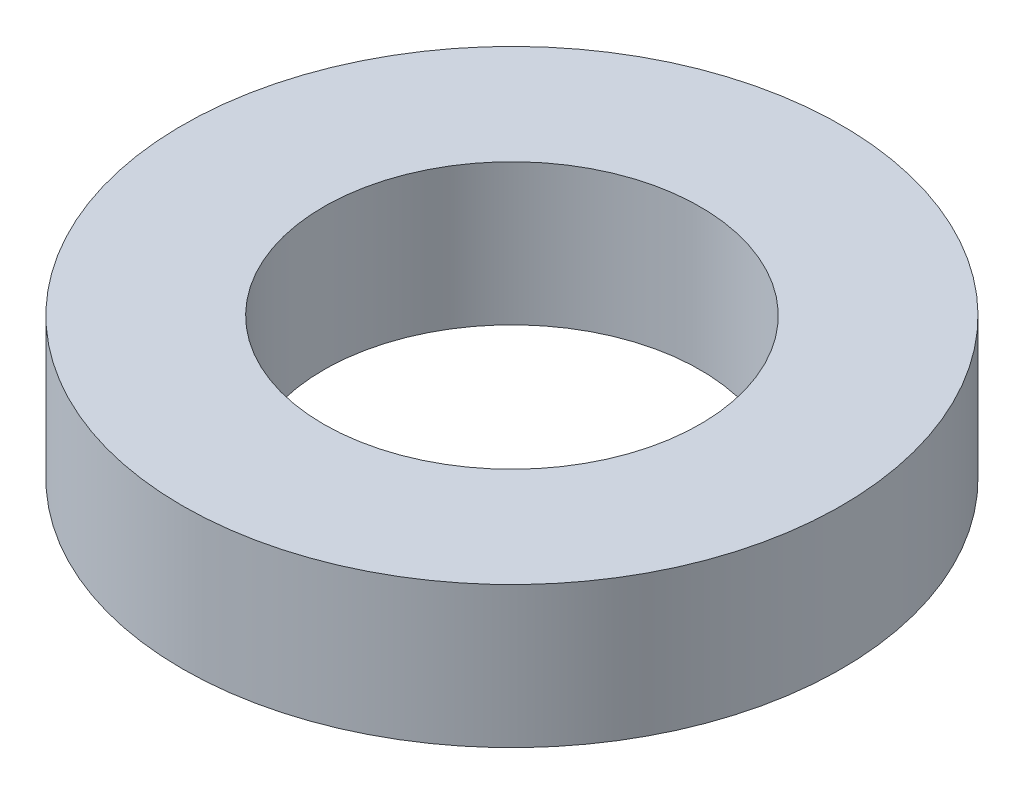
ISO-10303-21;
HEADER;
FILE_DESCRIPTION(('STEP AP214'),'2;1');
FILE_NAME('part.step','',(''),(''),'','','');
FILE_SCHEMA(('AUTOMOTIVE_DESIGN { 1 0 10303 214 1 1 1 1 }'));
ENDSEC;
DATA;
#1=APPLICATION_CONTEXT('core data for automotive mechanical design processes');
#2=APPLICATION_PROTOCOL_DEFINITION('international standard','automotive_design',2000,#1);
#3=PRODUCT_CONTEXT('',#1,'mechanical');
#4=PRODUCT('Part','Part','',(#3));
#5=PRODUCT_RELATED_PRODUCT_CATEGORY('part','',(#4));
#6=PRODUCT_DEFINITION_FORMATION('','',#4);
#7=PRODUCT_DEFINITION_CONTEXT('part definition',#1,'design');
#8=PRODUCT_DEFINITION('design','',#6,#7);
#9=PRODUCT_DEFINITION_SHAPE('','',#8);
#10=(LENGTH_UNIT() NAMED_UNIT(*) SI_UNIT(.MILLI.,.METRE.));
#11=(NAMED_UNIT(*) PLANE_ANGLE_UNIT() SI_UNIT($,.RADIAN.));
#12=(NAMED_UNIT(*) SI_UNIT($,.STERADIAN.) SOLID_ANGLE_UNIT());
#13=UNCERTAINTY_MEASURE_WITH_UNIT(LENGTH_MEASURE(1.E-05),#10,'distance_accuracy_value','');
#14=(GEOMETRIC_REPRESENTATION_CONTEXT(3) GLOBAL_UNCERTAINTY_ASSIGNED_CONTEXT((#13)) GLOBAL_UNIT_ASSIGNED_CONTEXT((#10,
#11,#12)) REPRESENTATION_CONTEXT('',''));
#15=CARTESIAN_POINT('',(0.,0.,0.));
#16=DIRECTION('',(0.,0.,1.));
#17=DIRECTION('',(1.,0.,0.));
#18=AXIS2_PLACEMENT_3D('',#15,#16,#17);
#19=CARTESIAN_POINT('',(0.,3.,0.));
#20=DIRECTION('',(0.,1.,0.));
#21=DIRECTION('',(0.,0.,1.));
#22=AXIS2_PLACEMENT_3D('',#19,#20,#21);
#23=PLANE('',#22);
#24=CARTESIAN_POINT('',(0.,3.,0.));
#25=DIRECTION('',(0.,1.,0.));
#26=DIRECTION('',(0.,0.,1.));
#27=AXIS2_PLACEMENT_3D('',#24,#25,#26);
#28=CIRCLE('',#27,4.);
#29=CARTESIAN_POINT('',(0.,3.,4.));
#30=VERTEX_POINT('',#29);
#31=EDGE_CURVE('E27',#30,#30,#28,.F.);
#32=ORIENTED_EDGE('',*,*,#31,.T.);
#33=EDGE_LOOP('',(#32));
#34=FACE_BOUND('',#33,.T.);
#35=CARTESIAN_POINT('',(0.,3.,0.));
#36=DIRECTION('',(0.,1.,0.));
#37=DIRECTION('',(0.,0.,1.));
#38=AXIS2_PLACEMENT_3D('',#35,#36,#37);
#39=CIRCLE('',#38,7.);
#40=CARTESIAN_POINT('',(0.,3.,7.));
#41=VERTEX_POINT('',#40);
#42=EDGE_CURVE('E18',#41,#41,#39,.F.);
#43=ORIENTED_EDGE('',*,*,#42,.F.);
#44=EDGE_LOOP('',(#43));
#45=FACE_BOUND('',#44,.T.);
#46=ADVANCED_FACE('F15',(#34,#45),#23,.T.);
#47=CARTESIAN_POINT('',(0.,0.,0.));
#48=DIRECTION('',(0.,1.,0.));
#49=DIRECTION('',(0.,0.,1.));
#50=AXIS2_PLACEMENT_3D('',#47,#48,#49);
#51=CYLINDRICAL_SURFACE('',#50,7.);
#52=ORIENTED_EDGE('',*,*,#42,.T.);
#53=EDGE_LOOP('',(#52));
#54=FACE_BOUND('',#53,.T.);
#55=CARTESIAN_POINT('',(0.,0.,0.));
#56=DIRECTION('',(0.,1.,0.));
#57=DIRECTION('',(0.,0.,1.));
#58=AXIS2_PLACEMENT_3D('',#55,#56,#57);
#59=CIRCLE('',#58,7.);
#60=CARTESIAN_POINT('',(0.,0.,7.));
#61=VERTEX_POINT('',#60);
#62=EDGE_CURVE('E22',#61,#61,#59,.T.);
#63=ORIENTED_EDGE('',*,*,#62,.T.);
#64=EDGE_LOOP('',(#63));
#65=FACE_BOUND('',#64,.T.);
#66=ADVANCED_FACE('F35',(#54,#65),#51,.T.);
#67=CARTESIAN_POINT('',(0.,0.,0.));
#68=DIRECTION('',(0.,1.,0.));
#69=DIRECTION('',(0.,0.,1.));
#70=AXIS2_PLACEMENT_3D('',#67,#68,#69);
#71=CYLINDRICAL_SURFACE('',#70,4.);
#72=ORIENTED_EDGE('',*,*,#31,.F.);
#73=EDGE_LOOP('',(#72));
#74=FACE_BOUND('',#73,.T.);
#75=CARTESIAN_POINT('',(0.,0.,0.));
#76=DIRECTION('',(0.,1.,0.));
#77=DIRECTION('',(0.,0.,1.));
#78=AXIS2_PLACEMENT_3D('',#75,#76,#77);
#79=CIRCLE('',#78,4.);
#80=CARTESIAN_POINT('',(0.,0.,4.));
#81=VERTEX_POINT('',#80);
#82=EDGE_CURVE('E10',#81,#81,#79,.F.);
#83=ORIENTED_EDGE('',*,*,#82,.T.);
#84=EDGE_LOOP('',(#83));
#85=FACE_BOUND('',#84,.T.);
#86=ADVANCED_FACE('F43',(#74,#85),#71,.F.);
#87=CARTESIAN_POINT('',(0.,0.,0.));
#88=DIRECTION('',(0.,1.,0.));
#89=DIRECTION('',(0.,0.,1.));
#90=AXIS2_PLACEMENT_3D('',#87,#88,#89);
#91=PLANE('',#90);
#92=ORIENTED_EDGE('',*,*,#82,.F.);
#93=EDGE_LOOP('',(#92));
#94=FACE_BOUND('',#93,.T.);
#95=ORIENTED_EDGE('',*,*,#62,.F.);
#96=EDGE_LOOP('',(#95));
#97=FACE_BOUND('',#96,.T.);
#98=ADVANCED_FACE('F44',(#94,#97),#91,.F.);
#99=CLOSED_SHELL('',(#46,#66,#86,#98));
#100=MANIFOLD_SOLID_BREP('B1',#99);
#101=ADVANCED_BREP_SHAPE_REPRESENTATION('',(#18,#100),#14);
#102=SHAPE_DEFINITION_REPRESENTATION(#9,#101);
ENDSEC;
END-ISO-10303-21;
